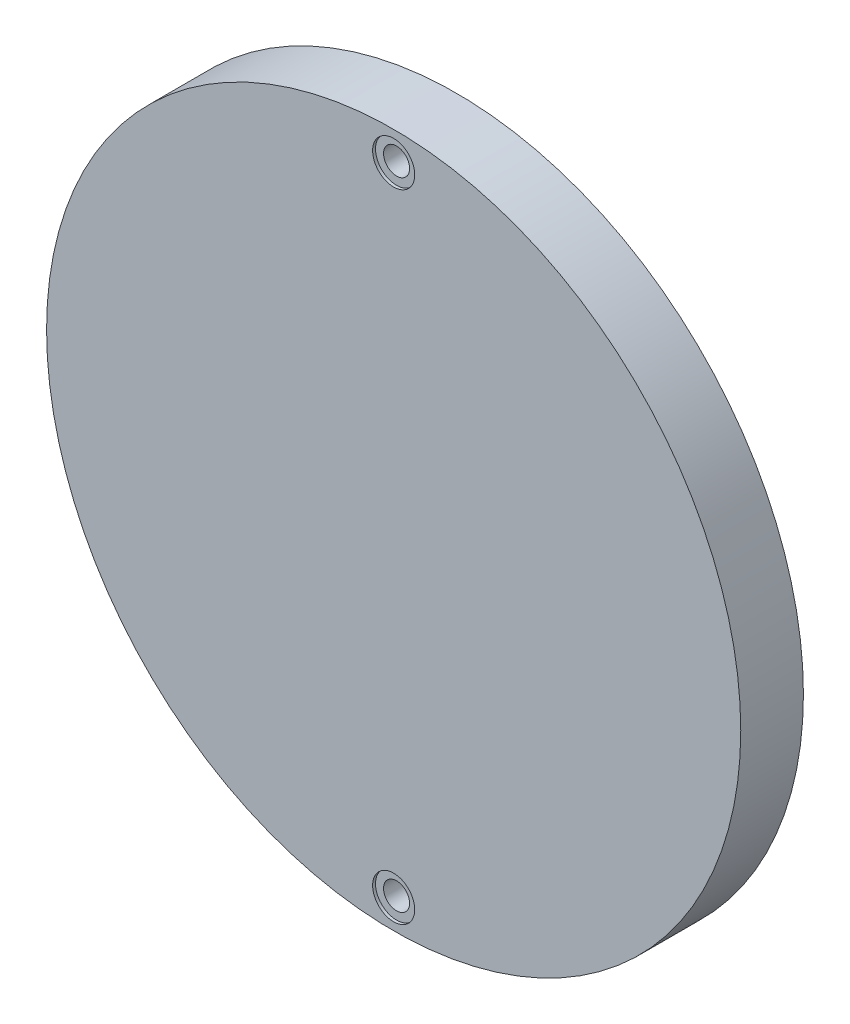
ISO-10303-21;
HEADER;
FILE_DESCRIPTION(('STEP AP214'),'2;1');
FILE_NAME('part.step','',(''),(''),'','','');
FILE_SCHEMA(('AUTOMOTIVE_DESIGN { 1 0 10303 214 1 1 1 1 }'));
ENDSEC;
DATA;
#1=APPLICATION_CONTEXT('core data for automotive mechanical design processes');
#2=APPLICATION_PROTOCOL_DEFINITION('international standard','automotive_design',2000,#1);
#3=PRODUCT_CONTEXT('',#1,'mechanical');
#4=PRODUCT('Part','Part','',(#3));
#5=PRODUCT_RELATED_PRODUCT_CATEGORY('part','',(#4));
#6=PRODUCT_DEFINITION_FORMATION('','',#4);
#7=PRODUCT_DEFINITION_CONTEXT('part definition',#1,'design');
#8=PRODUCT_DEFINITION('design','',#6,#7);
#9=PRODUCT_DEFINITION_SHAPE('','',#8);
#10=(LENGTH_UNIT() NAMED_UNIT(*) SI_UNIT(.MILLI.,.METRE.));
#11=(NAMED_UNIT(*) PLANE_ANGLE_UNIT() SI_UNIT($,.RADIAN.));
#12=(NAMED_UNIT(*) SI_UNIT($,.STERADIAN.) SOLID_ANGLE_UNIT());
#13=UNCERTAINTY_MEASURE_WITH_UNIT(LENGTH_MEASURE(1.E-05),#10,'distance_accuracy_value','');
#14=(GEOMETRIC_REPRESENTATION_CONTEXT(3) GLOBAL_UNCERTAINTY_ASSIGNED_CONTEXT((#13)) GLOBAL_UNIT_ASSIGNED_CONTEXT((#10,
#11,#12)) REPRESENTATION_CONTEXT('',''));
#15=CARTESIAN_POINT('',(0.,0.,0.));
#16=DIRECTION('',(0.,0.,1.));
#17=DIRECTION('',(1.,0.,0.));
#18=AXIS2_PLACEMENT_3D('',#15,#16,#17);
#19=CARTESIAN_POINT('',(0.,33.,0.));
#20=DIRECTION('',(0.,0.,-1.));
#21=DIRECTION('',(-1.,0.,0.));
#22=AXIS2_PLACEMENT_3D('',#19,#20,#21);
#23=CYLINDRICAL_SURFACE('',#22,1.349999967);
#24=CARTESIAN_POINT('',(0.,33.,1.13277999864161));
#25=DIRECTION('',(0.,0.,-1.));
#26=DIRECTION('',(-1.,0.,0.));
#27=AXIS2_PLACEMENT_3D('',#24,#25,#26);
#28=CIRCLE('',#27,1.349999967);
#29=CARTESIAN_POINT('',(-1.349999967,33.,1.13277999864161));
#30=VERTEX_POINT('',#29);
#31=EDGE_CURVE('E65',#30,#30,#28,.T.);
#32=ORIENTED_EDGE('',*,*,#31,.T.);
#33=EDGE_LOOP('',(#32));
#34=FACE_BOUND('',#33,.T.);
#35=CARTESIAN_POINT('',(0.,33.,6.2));
#36=DIRECTION('',(0.,0.,1.));
#37=DIRECTION('',(1.,0.,0.));
#38=AXIS2_PLACEMENT_3D('',#35,#36,#37);
#39=CIRCLE('',#38,1.349999967);
#40=CARTESIAN_POINT('',(1.349999967,33.,6.2));
#41=VERTEX_POINT('',#40);
#42=EDGE_CURVE('E39',#41,#41,#39,.F.);
#43=ORIENTED_EDGE('',*,*,#42,.F.);
#44=EDGE_LOOP('',(#43));
#45=FACE_BOUND('',#44,.T.);
#46=ADVANCED_FACE('F35',(#34,#45),#23,.F.);
#47=CARTESIAN_POINT('',(0.,-33.,0.));
#48=DIRECTION('',(0.,0.,-1.));
#49=DIRECTION('',(-1.,0.,0.));
#50=AXIS2_PLACEMENT_3D('',#47,#48,#49);
#51=CYLINDRICAL_SURFACE('',#50,1.349999967);
#52=CARTESIAN_POINT('',(0.,-33.,1.13277999864161));
#53=DIRECTION('',(0.,0.,-1.));
#54=DIRECTION('',(-1.,0.,0.));
#55=AXIS2_PLACEMENT_3D('',#52,#53,#54);
#56=CIRCLE('',#55,1.349999967);
#57=CARTESIAN_POINT('',(-1.349999967,-33.,1.13277999864161));
#58=VERTEX_POINT('',#57);
#59=EDGE_CURVE('E48',#58,#58,#56,.T.);
#60=ORIENTED_EDGE('',*,*,#59,.T.);
#61=EDGE_LOOP('',(#60));
#62=FACE_BOUND('',#61,.T.);
#63=CARTESIAN_POINT('',(0.,-33.,6.2));
#64=DIRECTION('',(0.,0.,1.));
#65=DIRECTION('',(1.,0.,0.));
#66=AXIS2_PLACEMENT_3D('',#63,#64,#65);
#67=CIRCLE('',#66,1.349999967);
#68=CARTESIAN_POINT('',(1.349999967,-33.,6.2));
#69=VERTEX_POINT('',#68);
#70=EDGE_CURVE('E52',#69,#69,#67,.F.);
#71=ORIENTED_EDGE('',*,*,#70,.F.);
#72=EDGE_LOOP('',(#71));
#73=FACE_BOUND('',#72,.T.);
#74=ADVANCED_FACE('F86',(#62,#73),#51,.F.);
#75=CARTESIAN_POINT('',(0.,0.,6.5));
#76=DIRECTION('',(0.,0.,-1.));
#77=DIRECTION('',(-1.,0.,0.));
#78=AXIS2_PLACEMENT_3D('',#75,#76,#77);
#79=CYLINDRICAL_SURFACE('',#78,36.);
#80=CARTESIAN_POINT('',(0.,0.,6.5));
#81=DIRECTION('',(0.,0.,1.));
#82=DIRECTION('',(1.,0.,0.));
#83=AXIS2_PLACEMENT_3D('',#80,#81,#82);
#84=CIRCLE('',#83,36.);
#85=CARTESIAN_POINT('',(-36.,0.,6.5));
#86=VERTEX_POINT('',#85);
#87=EDGE_CURVE('E10',#86,#86,#84,.T.);
#88=CARTESIAN_POINT('',(0.,0.,0.));
#89=DIRECTION('',(0.,0.,1.));
#90=DIRECTION('',(1.,0.,0.));
#91=AXIS2_PLACEMENT_3D('',#88,#89,#90);
#92=CIRCLE('',#91,36.);
#93=CARTESIAN_POINT('',(-36.,0.,0.));
#94=VERTEX_POINT('',#93);
#95=EDGE_CURVE('E43',#94,#94,#92,.T.);
#96=CARTESIAN_POINT('',(-36.,0.,6.5));
#97=CARTESIAN_POINT('',(-36.,0.,6.43229166666667));
#98=CARTESIAN_POINT('',(-36.,0.,6.36458333333333));
#99=CARTESIAN_POINT('',(-36.,0.,6.22916666666667));
#100=CARTESIAN_POINT('',(-36.,0.,6.16145833333333));
#101=CARTESIAN_POINT('',(-36.,0.,6.02604166666667));
#102=CARTESIAN_POINT('',(-36.,0.,5.95833333333333));
#103=CARTESIAN_POINT('',(-36.,0.,5.82291666666667));
#104=CARTESIAN_POINT('',(-36.,0.,5.75520833333333));
#105=CARTESIAN_POINT('',(-36.,0.,5.61979166666667));
#106=CARTESIAN_POINT('',(-36.,0.,5.55208333333333));
#107=CARTESIAN_POINT('',(-36.,0.,5.41666666666667));
#108=CARTESIAN_POINT('',(-36.,0.,5.34895833333333));
#109=CARTESIAN_POINT('',(-36.,0.,5.21354166666667));
#110=CARTESIAN_POINT('',(-36.,0.,5.14583333333333));
#111=CARTESIAN_POINT('',(-36.,0.,5.01041666666667));
#112=CARTESIAN_POINT('',(-36.,0.,4.94270833333333));
#113=CARTESIAN_POINT('',(-36.,0.,4.80729166666667));
#114=CARTESIAN_POINT('',(-36.,0.,4.73958333333333));
#115=CARTESIAN_POINT('',(-36.,0.,4.60416666666667));
#116=CARTESIAN_POINT('',(-36.,0.,4.53645833333333));
#117=CARTESIAN_POINT('',(-36.,0.,4.40104166666667));
#118=CARTESIAN_POINT('',(-36.,0.,4.33333333333333));
#119=CARTESIAN_POINT('',(-36.,0.,4.19791666666667));
#120=CARTESIAN_POINT('',(-36.,0.,4.13020833333333));
#121=CARTESIAN_POINT('',(-36.,0.,3.99479166666667));
#122=CARTESIAN_POINT('',(-36.,0.,3.92708333333333));
#123=CARTESIAN_POINT('',(-36.,0.,3.79166666666667));
#124=CARTESIAN_POINT('',(-36.,0.,3.72395833333333));
#125=CARTESIAN_POINT('',(-36.,0.,3.58854166666667));
#126=CARTESIAN_POINT('',(-36.,0.,3.52083333333333));
#127=CARTESIAN_POINT('',(-36.,0.,3.38541666666667));
#128=CARTESIAN_POINT('',(-36.,0.,3.31770833333333));
#129=CARTESIAN_POINT('',(-36.,0.,3.18229166666667));
#130=CARTESIAN_POINT('',(-36.,0.,3.11458333333333));
#131=CARTESIAN_POINT('',(-36.,0.,2.97916666666667));
#132=CARTESIAN_POINT('',(-36.,0.,2.91145833333333));
#133=CARTESIAN_POINT('',(-36.,0.,2.77604166666667));
#134=CARTESIAN_POINT('',(-36.,0.,2.70833333333333));
#135=CARTESIAN_POINT('',(-36.,0.,2.57291666666667));
#136=CARTESIAN_POINT('',(-36.,0.,2.50520833333333));
#137=CARTESIAN_POINT('',(-36.,0.,2.36979166666667));
#138=CARTESIAN_POINT('',(-36.,0.,2.30208333333333));
#139=CARTESIAN_POINT('',(-36.,0.,2.16666666666667));
#140=CARTESIAN_POINT('',(-36.,0.,2.09895833333333));
#141=CARTESIAN_POINT('',(-36.,0.,1.96354166666667));
#142=CARTESIAN_POINT('',(-36.,0.,1.89583333333333));
#143=CARTESIAN_POINT('',(-36.,0.,1.76041666666667));
#144=CARTESIAN_POINT('',(-36.,0.,1.69270833333333));
#145=CARTESIAN_POINT('',(-36.,0.,1.55729166666667));
#146=CARTESIAN_POINT('',(-36.,0.,1.48958333333333));
#147=CARTESIAN_POINT('',(-36.,0.,1.35416666666667));
#148=CARTESIAN_POINT('',(-36.,0.,1.28645833333333));
#149=CARTESIAN_POINT('',(-36.,0.,1.15104166666667));
#150=CARTESIAN_POINT('',(-36.,0.,1.08333333333333));
#151=CARTESIAN_POINT('',(-36.,0.,0.947916666666667));
#152=CARTESIAN_POINT('',(-36.,0.,0.880208333333333));
#153=CARTESIAN_POINT('',(-36.,0.,0.744791666666667));
#154=CARTESIAN_POINT('',(-36.,0.,0.677083333333333));
#155=CARTESIAN_POINT('',(-36.,0.,0.541666666666667));
#156=CARTESIAN_POINT('',(-36.,0.,0.473958333333333));
#157=CARTESIAN_POINT('',(-36.,0.,0.338541666666667));
#158=CARTESIAN_POINT('',(-36.,0.,0.270833333333334));
#159=CARTESIAN_POINT('',(-36.,0.,0.135416666666667));
#160=CARTESIAN_POINT('',(-36.,0.,0.0677083333333334));
#161=CARTESIAN_POINT('',(-36.,0.,0.));
#162=B_SPLINE_CURVE_WITH_KNOTS('',3,(#96,#97,#98,#99,#100,#101,#102,#103,#104,#105,#106,#107,
#108,#109,#110,#111,#112,#113,#114,#115,#116,#117,#118,#119,#120,#121,#122,#123,#124,#125,#126,
#127,#128,#129,#130,#131,#132,#133,#134,#135,#136,#137,#138,#139,#140,#141,#142,#143,#144,#145,
#146,#147,#148,#149,#150,#151,#152,#153,#154,#155,#156,#157,#158,#159,#160,#161),.UNSPECIFIED.,
.F.,.F.,(4,2,2,2,2,2,2,2,2,2,2,2,2,2,2,2,2,2,2,2,2,2,2,2,2,2,2,2,2,2,2,2,4),(0.,0.203125,
0.40625,0.609375000000001,0.812500000000001,1.015625,1.21875,1.421875,1.625,1.828125,2.03125,
2.234375,2.4375,2.640625,2.84375,3.046875,3.25,3.453125,3.65625,3.859375,4.0625,4.265625,
4.46875,4.671875,4.875,5.078125,5.28125,5.484375,5.6875,5.890625,6.09375,6.296875,6.5),.UNSPECIFIED.);
#163=EDGE_CURVE('BSEAM37',#86,#94,#162,.T.);
#164=ORIENTED_EDGE('',*,*,#87,.F.);
#165=ORIENTED_EDGE('',*,*,#95,.T.);
#166=ORIENTED_EDGE('',*,*,#163,.T.);
#167=ORIENTED_EDGE('',*,*,#163,.F.);
#168=EDGE_LOOP('',(#164,#166,#165,#167));
#169=FACE_BOUND('',#168,.T.);
#170=ADVANCED_FACE('F37',(#169),#79,.T.);
#171=CARTESIAN_POINT('',(0.,0.,6.5));
#172=DIRECTION('',(0.,0.,1.));
#173=DIRECTION('',(1.,0.,0.));
#174=AXIS2_PLACEMENT_3D('',#171,#172,#173);
#175=PLANE('',#174);
#176=CARTESIAN_POINT('',(0.,33.,6.5));
#177=DIRECTION('',(0.,0.,-1.));
#178=DIRECTION('',(1.,0.,0.));
#179=AXIS2_PLACEMENT_3D('',#176,#177,#178);
#180=CIRCLE('',#179,2.1844);
#181=CARTESIAN_POINT('',(2.1844,33.,6.5));
#182=VERTEX_POINT('',#181);
#183=EDGE_CURVE('E73',#182,#182,#180,.T.);
#184=ORIENTED_EDGE('',*,*,#183,.T.);
#185=EDGE_LOOP('',(#184));
#186=FACE_BOUND('',#185,.T.);
#187=CARTESIAN_POINT('',(0.,-33.,6.5));
#188=DIRECTION('',(0.,0.,1.));
#189=DIRECTION('',(1.,0.,0.));
#190=AXIS2_PLACEMENT_3D('',#187,#188,#189);
#191=CIRCLE('',#190,2.1844);
#192=CARTESIAN_POINT('',(2.1844,-33.,6.5));
#193=VERTEX_POINT('',#192);
#194=EDGE_CURVE('E60',#193,#193,#191,.T.);
#195=ORIENTED_EDGE('',*,*,#194,.F.);
#196=EDGE_LOOP('',(#195));
#197=FACE_BOUND('',#196,.T.);
#198=ORIENTED_EDGE('',*,*,#87,.T.);
#199=EDGE_LOOP('',(#198));
#200=FACE_BOUND('',#199,.T.);
#201=ADVANCED_FACE('F110',(#186,#197,#200),#175,.T.);
#202=CARTESIAN_POINT('',(0.,0.,0.));
#203=DIRECTION('',(0.,0.,1.));
#204=DIRECTION('',(1.,0.,0.));
#205=AXIS2_PLACEMENT_3D('',#202,#203,#204);
#206=PLANE('',#205);
#207=CARTESIAN_POINT('',(0.,33.,0.));
#208=DIRECTION('',(0.,0.,-1.));
#209=DIRECTION('',(-1.,0.,0.));
#210=AXIS2_PLACEMENT_3D('',#207,#208,#209);
#211=CIRCLE('',#210,2.6999946);
#212=CARTESIAN_POINT('',(-2.6999946,33.,0.));
#213=VERTEX_POINT('',#212);
#214=EDGE_CURVE('E70',#213,#213,#211,.T.);
#215=ORIENTED_EDGE('',*,*,#214,.F.);
#216=EDGE_LOOP('',(#215));
#217=FACE_BOUND('',#216,.T.);
#218=CARTESIAN_POINT('',(0.,-33.,0.));
#219=DIRECTION('',(0.,0.,-1.));
#220=DIRECTION('',(-1.,0.,0.));
#221=AXIS2_PLACEMENT_3D('',#218,#219,#220);
#222=CIRCLE('',#221,2.6999946);
#223=CARTESIAN_POINT('',(-2.6999946,-33.,0.));
#224=VERTEX_POINT('',#223);
#225=EDGE_CURVE('E54',#224,#224,#222,.T.);
#226=ORIENTED_EDGE('',*,*,#225,.F.);
#227=EDGE_LOOP('',(#226));
#228=FACE_BOUND('',#227,.T.);
#229=ORIENTED_EDGE('',*,*,#95,.F.);
#230=EDGE_LOOP('',(#229));
#231=FACE_BOUND('',#230,.T.);
#232=ADVANCED_FACE('F107',(#217,#228,#231),#206,.F.);
#233=CARTESIAN_POINT('',(0.,-33.,0.));
#234=DIRECTION('',(0.,0.,-1.));
#235=DIRECTION('',(-1.,0.,0.));
#236=AXIS2_PLACEMENT_3D('',#233,#234,#235);
#237=CONICAL_SURFACE('',#236,2.6999946,0.872664625997165);
#238=ORIENTED_EDGE('',*,*,#59,.F.);
#239=EDGE_LOOP('',(#238));
#240=FACE_BOUND('',#239,.T.);
#241=ORIENTED_EDGE('',*,*,#225,.T.);
#242=EDGE_LOOP('',(#241));
#243=FACE_BOUND('',#242,.T.);
#244=ADVANCED_FACE('F102',(#240,#243),#237,.F.);
#245=CARTESIAN_POINT('',(0.,-33.,6.2));
#246=DIRECTION('',(0.,0.,1.));
#247=DIRECTION('',(1.,0.,0.));
#248=AXIS2_PLACEMENT_3D('',#245,#246,#247);
#249=PLANE('',#248);
#250=CARTESIAN_POINT('',(0.,-33.,6.2));
#251=DIRECTION('',(0.,0.,1.));
#252=DIRECTION('',(1.,0.,0.));
#253=AXIS2_PLACEMENT_3D('',#250,#251,#252);
#254=CIRCLE('',#253,2.1844);
#255=CARTESIAN_POINT('',(2.1844,-33.,6.2));
#256=VERTEX_POINT('',#255);
#257=EDGE_CURVE('E55',#256,#256,#254,.T.);
#258=ORIENTED_EDGE('',*,*,#257,.T.);
#259=EDGE_LOOP('',(#258));
#260=FACE_BOUND('',#259,.T.);
#261=ORIENTED_EDGE('',*,*,#70,.T.);
#262=EDGE_LOOP('',(#261));
#263=FACE_BOUND('',#262,.T.);
#264=ADVANCED_FACE('F98',(#260,#263),#249,.T.);
#265=CARTESIAN_POINT('',(0.,-33.,6.2));
#266=DIRECTION('',(0.,0.,1.));
#267=DIRECTION('',(1.,0.,0.));
#268=AXIS2_PLACEMENT_3D('',#265,#266,#267);
#269=CYLINDRICAL_SURFACE('',#268,2.1844);
#270=ORIENTED_EDGE('',*,*,#257,.F.);
#271=EDGE_LOOP('',(#270));
#272=FACE_BOUND('',#271,.T.);
#273=ORIENTED_EDGE('',*,*,#194,.T.);
#274=EDGE_LOOP('',(#273));
#275=FACE_BOUND('',#274,.T.);
#276=ADVANCED_FACE('F101',(#272,#275),#269,.F.);
#277=CARTESIAN_POINT('',(0.,33.,0.));
#278=DIRECTION('',(0.,0.,-1.));
#279=DIRECTION('',(-1.,0.,0.));
#280=AXIS2_PLACEMENT_3D('',#277,#278,#279);
#281=CONICAL_SURFACE('',#280,2.6999946,0.872664625997165);
#282=ORIENTED_EDGE('',*,*,#31,.F.);
#283=EDGE_LOOP('',(#282));
#284=FACE_BOUND('',#283,.T.);
#285=ORIENTED_EDGE('',*,*,#214,.T.);
#286=EDGE_LOOP('',(#285));
#287=FACE_BOUND('',#286,.T.);
#288=ADVANCED_FACE('F96',(#284,#287),#281,.F.);
#289=CARTESIAN_POINT('',(0.,33.,6.2));
#290=DIRECTION('',(0.,0.,1.));
#291=DIRECTION('',(1.,0.,0.));
#292=AXIS2_PLACEMENT_3D('',#289,#290,#291);
#293=PLANE('',#292);
#294=CARTESIAN_POINT('',(0.,33.,6.2));
#295=DIRECTION('',(0.,0.,-1.));
#296=DIRECTION('',(1.,0.,0.));
#297=AXIS2_PLACEMENT_3D('',#294,#295,#296);
#298=CIRCLE('',#297,2.1844);
#299=CARTESIAN_POINT('',(2.1844,33.,6.2));
#300=VERTEX_POINT('',#299);
#301=EDGE_CURVE('E76',#300,#300,#298,.T.);
#302=ORIENTED_EDGE('',*,*,#301,.F.);
#303=EDGE_LOOP('',(#302));
#304=FACE_BOUND('',#303,.T.);
#305=ORIENTED_EDGE('',*,*,#42,.T.);
#306=EDGE_LOOP('',(#305));
#307=FACE_BOUND('',#306,.T.);
#308=ADVANCED_FACE('F83',(#304,#307),#293,.T.);
#309=CARTESIAN_POINT('',(0.,33.,6.2));
#310=DIRECTION('',(0.,0.,1.));
#311=DIRECTION('',(1.,0.,0.));
#312=AXIS2_PLACEMENT_3D('',#309,#310,#311);
#313=CYLINDRICAL_SURFACE('',#312,2.1844);
#314=ORIENTED_EDGE('',*,*,#301,.T.);
#315=EDGE_LOOP('',(#314));
#316=FACE_BOUND('',#315,.T.);
#317=ORIENTED_EDGE('',*,*,#183,.F.);
#318=EDGE_LOOP('',(#317));
#319=FACE_BOUND('',#318,.T.);
#320=ADVANCED_FACE('F162',(#316,#319),#313,.F.);
#321=CLOSED_SHELL('',(#46,#74,#170,#201,#232,#244,#264,#276,#288,#308,#320));
#322=MANIFOLD_SOLID_BREP('B2',#321);
#323=ADVANCED_BREP_SHAPE_REPRESENTATION('',(#18,#322),#14);
#324=SHAPE_DEFINITION_REPRESENTATION(#9,#323);
ENDSEC;
END-ISO-10303-21;
